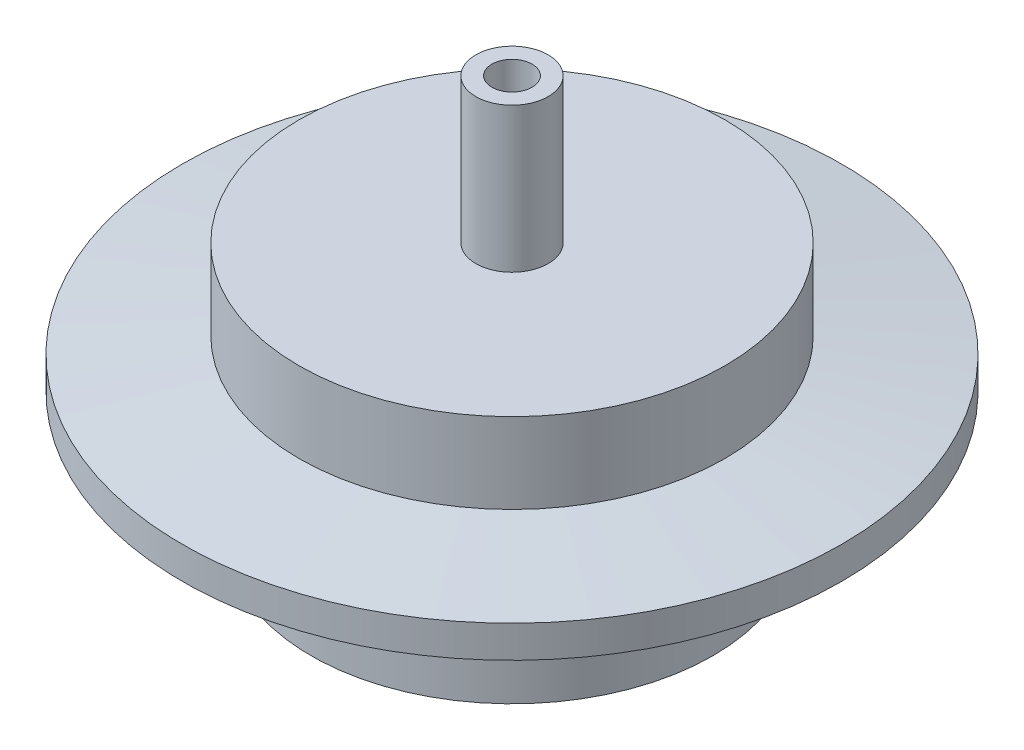
ISO-10303-21;
HEADER;
FILE_DESCRIPTION(('STEP AP214'),'2;1');
FILE_NAME('part.step','',(''),(''),'','','');
FILE_SCHEMA(('AUTOMOTIVE_DESIGN { 1 0 10303 214 1 1 1 1 }'));
ENDSEC;
DATA;
#1=APPLICATION_CONTEXT('core data for automotive mechanical design processes');
#2=APPLICATION_PROTOCOL_DEFINITION('international standard','automotive_design',2000,#1);
#3=PRODUCT_CONTEXT('',#1,'mechanical');
#4=PRODUCT('Part','Part','',(#3));
#5=PRODUCT_RELATED_PRODUCT_CATEGORY('part','',(#4));
#6=PRODUCT_DEFINITION_FORMATION('','',#4);
#7=PRODUCT_DEFINITION_CONTEXT('part definition',#1,'design');
#8=PRODUCT_DEFINITION('design','',#6,#7);
#9=PRODUCT_DEFINITION_SHAPE('','',#8);
#10=(LENGTH_UNIT() NAMED_UNIT(*) SI_UNIT(.MILLI.,.METRE.));
#11=(NAMED_UNIT(*) PLANE_ANGLE_UNIT() SI_UNIT($,.RADIAN.));
#12=(NAMED_UNIT(*) SI_UNIT($,.STERADIAN.) SOLID_ANGLE_UNIT());
#13=UNCERTAINTY_MEASURE_WITH_UNIT(LENGTH_MEASURE(1.E-05),#10,'distance_accuracy_value','');
#14=(GEOMETRIC_REPRESENTATION_CONTEXT(3) GLOBAL_UNCERTAINTY_ASSIGNED_CONTEXT((#13)) GLOBAL_UNIT_ASSIGNED_CONTEXT((#10,
#11,#12)) REPRESENTATION_CONTEXT('',''));
#15=CARTESIAN_POINT('',(0.,0.,0.));
#16=DIRECTION('',(0.,0.,1.));
#17=DIRECTION('',(1.,0.,0.));
#18=AXIS2_PLACEMENT_3D('',#15,#16,#17);
#19=CARTESIAN_POINT('',(1.,0.,0.));
#20=DIRECTION('',(0.,1.,0.));
#21=DIRECTION('',(-1.,0.,0.));
#22=AXIS2_PLACEMENT_3D('',#19,#20,#21);
#23=PLANE('',#22);
#24=CARTESIAN_POINT('',(2.25,0.,0.));
#25=DIRECTION('',(0.,1.,0.));
#26=DIRECTION('',(-1.,0.,0.));
#27=AXIS2_PLACEMENT_3D('',#24,#25,#26);
#28=CIRCLE('',#27,2.25);
#29=CARTESIAN_POINT('',(0.,0.,0.));
#30=VERTEX_POINT('',#29);
#31=EDGE_CURVE('E10',#30,#30,#28,.T.);
#32=ORIENTED_EDGE('',*,*,#31,.T.);
#33=EDGE_LOOP('',(#32));
#34=FACE_BOUND('',#33,.T.);
#35=CARTESIAN_POINT('',(2.25,0.,0.));
#36=DIRECTION('',(0.,1.,0.));
#37=DIRECTION('',(-1.,0.,0.));
#38=AXIS2_PLACEMENT_3D('',#35,#36,#37);
#39=CIRCLE('',#38,1.25);
#40=CARTESIAN_POINT('',(1.,0.,0.));
#41=VERTEX_POINT('',#40);
#42=EDGE_CURVE('E71',#41,#41,#39,.T.);
#43=ORIENTED_EDGE('',*,*,#42,.F.);
#44=EDGE_LOOP('',(#43));
#45=FACE_BOUND('',#44,.T.);
#46=ADVANCED_FACE('F31',(#34,#45),#23,.T.);
#47=CARTESIAN_POINT('',(2.25,0.,0.));
#48=DIRECTION('',(0.,1.,0.));
#49=DIRECTION('',(-1.,0.,0.));
#50=AXIS2_PLACEMENT_3D('',#47,#48,#49);
#51=CYLINDRICAL_SURFACE('',#50,2.25);
#52=CARTESIAN_POINT('',(2.25,-9.,0.));
#53=DIRECTION('',(0.,1.,0.));
#54=DIRECTION('',(-1.,0.,0.));
#55=AXIS2_PLACEMENT_3D('',#52,#53,#54);
#56=CIRCLE('',#55,2.25);
#57=CARTESIAN_POINT('',(0.,-9.,0.));
#58=VERTEX_POINT('',#57);
#59=EDGE_CURVE('E37',#58,#58,#56,.T.);
#60=ORIENTED_EDGE('',*,*,#59,.T.);
#61=EDGE_LOOP('',(#60));
#62=FACE_BOUND('',#61,.T.);
#63=ORIENTED_EDGE('',*,*,#31,.F.);
#64=EDGE_LOOP('',(#63));
#65=FACE_BOUND('',#64,.T.);
#66=ADVANCED_FACE('F79',(#62,#65),#51,.T.);
#67=CARTESIAN_POINT('',(0.,-9.,0.));
#68=DIRECTION('',(0.,1.,0.));
#69=DIRECTION('',(-1.,0.,0.));
#70=AXIS2_PLACEMENT_3D('',#67,#68,#69);
#71=PLANE('',#70);
#72=CARTESIAN_POINT('',(2.25,-9.,0.));
#73=DIRECTION('',(0.,1.,0.));
#74=DIRECTION('',(-1.,0.,0.));
#75=AXIS2_PLACEMENT_3D('',#72,#73,#74);
#76=CIRCLE('',#75,13.25);
#77=CARTESIAN_POINT('',(-11.,-9.,0.));
#78=VERTEX_POINT('',#77);
#79=EDGE_CURVE('E41',#78,#78,#76,.T.);
#80=ORIENTED_EDGE('',*,*,#79,.T.);
#81=EDGE_LOOP('',(#80));
#82=FACE_BOUND('',#81,.T.);
#83=ORIENTED_EDGE('',*,*,#59,.F.);
#84=EDGE_LOOP('',(#83));
#85=FACE_BOUND('',#84,.T.);
#86=ADVANCED_FACE('F83',(#82,#85),#71,.T.);
#87=CARTESIAN_POINT('',(2.25,0.,0.));
#88=DIRECTION('',(0.,1.,0.));
#89=DIRECTION('',(-1.,0.,0.));
#90=AXIS2_PLACEMENT_3D('',#87,#88,#89);
#91=CYLINDRICAL_SURFACE('',#90,13.25);
#92=CARTESIAN_POINT('',(2.25,-14.,0.));
#93=DIRECTION('',(0.,1.,0.));
#94=DIRECTION('',(-1.,0.,0.));
#95=AXIS2_PLACEMENT_3D('',#92,#93,#94);
#96=CIRCLE('',#95,13.25);
#97=CARTESIAN_POINT('',(-11.,-14.,0.));
#98=VERTEX_POINT('',#97);
#99=EDGE_CURVE('E45',#98,#98,#96,.T.);
#100=ORIENTED_EDGE('',*,*,#99,.T.);
#101=EDGE_LOOP('',(#100));
#102=FACE_BOUND('',#101,.T.);
#103=ORIENTED_EDGE('',*,*,#79,.F.);
#104=EDGE_LOOP('',(#103));
#105=FACE_BOUND('',#104,.T.);
#106=ADVANCED_FACE('F87',(#102,#105),#91,.T.);
#107=CARTESIAN_POINT('',(2.25,-14.,0.));
#108=DIRECTION('',(0.,-1.,0.));
#109=DIRECTION('',(1.,0.,0.));
#110=AXIS2_PLACEMENT_3D('',#107,#108,#109);
#111=CONICAL_SURFACE('',#110,13.25,1.43373015248471);
#112=CARTESIAN_POINT('',(2.25,-15.,0.));
#113=DIRECTION('',(0.,1.,0.));
#114=DIRECTION('',(-1.,0.,0.));
#115=AXIS2_PLACEMENT_3D('',#112,#113,#114);
#116=CIRCLE('',#115,20.5);
#117=CARTESIAN_POINT('',(-18.25,-15.,0.));
#118=VERTEX_POINT('',#117);
#119=EDGE_CURVE('E50',#118,#118,#116,.T.);
#120=ORIENTED_EDGE('',*,*,#119,.T.);
#121=EDGE_LOOP('',(#120));
#122=FACE_BOUND('',#121,.T.);
#123=ORIENTED_EDGE('',*,*,#99,.F.);
#124=EDGE_LOOP('',(#123));
#125=FACE_BOUND('',#124,.T.);
#126=ADVANCED_FACE('F94',(#122,#125),#111,.T.);
#127=CARTESIAN_POINT('',(2.25,0.,0.));
#128=DIRECTION('',(0.,1.,0.));
#129=DIRECTION('',(-1.,0.,0.));
#130=AXIS2_PLACEMENT_3D('',#127,#128,#129);
#131=CYLINDRICAL_SURFACE('',#130,20.5);
#132=CARTESIAN_POINT('',(2.25,-17.,0.));
#133=DIRECTION('',(0.,1.,0.));
#134=DIRECTION('',(-1.,0.,0.));
#135=AXIS2_PLACEMENT_3D('',#132,#133,#134);
#136=CIRCLE('',#135,20.5);
#137=CARTESIAN_POINT('',(-18.25,-17.,0.));
#138=VERTEX_POINT('',#137);
#139=EDGE_CURVE('E53',#138,#138,#136,.T.);
#140=ORIENTED_EDGE('',*,*,#139,.T.);
#141=EDGE_LOOP('',(#140));
#142=FACE_BOUND('',#141,.T.);
#143=ORIENTED_EDGE('',*,*,#119,.F.);
#144=EDGE_LOOP('',(#143));
#145=FACE_BOUND('',#144,.T.);
#146=ADVANCED_FACE('F98',(#142,#145),#131,.T.);
#147=CARTESIAN_POINT('',(-18.25,-17.,0.));
#148=DIRECTION('',(0.,-1.,0.));
#149=DIRECTION('',(1.,0.,0.));
#150=AXIS2_PLACEMENT_3D('',#147,#148,#149);
#151=PLANE('',#150);
#152=CARTESIAN_POINT('',(2.25,-17.,0.));
#153=DIRECTION('',(0.,1.,0.));
#154=DIRECTION('',(-1.,0.,0.));
#155=AXIS2_PLACEMENT_3D('',#152,#153,#154);
#156=CIRCLE('',#155,12.5);
#157=CARTESIAN_POINT('',(-10.25,-17.,0.));
#158=VERTEX_POINT('',#157);
#159=EDGE_CURVE('E56',#158,#158,#156,.T.);
#160=ORIENTED_EDGE('',*,*,#159,.T.);
#161=EDGE_LOOP('',(#160));
#162=FACE_BOUND('',#161,.T.);
#163=ORIENTED_EDGE('',*,*,#139,.F.);
#164=EDGE_LOOP('',(#163));
#165=FACE_BOUND('',#164,.T.);
#166=ADVANCED_FACE('F102',(#162,#165),#151,.T.);
#167=CARTESIAN_POINT('',(2.25,0.,0.));
#168=DIRECTION('',(0.,1.,0.));
#169=DIRECTION('',(-1.,0.,0.));
#170=AXIS2_PLACEMENT_3D('',#167,#168,#169);
#171=CYLINDRICAL_SURFACE('',#170,12.5);
#172=CARTESIAN_POINT('',(2.25,-25.,0.));
#173=DIRECTION('',(0.,1.,0.));
#174=DIRECTION('',(-1.,0.,0.));
#175=AXIS2_PLACEMENT_3D('',#172,#173,#174);
#176=CIRCLE('',#175,12.5);
#177=CARTESIAN_POINT('',(-10.25,-25.,0.));
#178=VERTEX_POINT('',#177);
#179=EDGE_CURVE('E59',#178,#178,#176,.T.);
#180=ORIENTED_EDGE('',*,*,#179,.T.);
#181=EDGE_LOOP('',(#180));
#182=FACE_BOUND('',#181,.T.);
#183=ORIENTED_EDGE('',*,*,#159,.F.);
#184=EDGE_LOOP('',(#183));
#185=FACE_BOUND('',#184,.T.);
#186=ADVANCED_FACE('F106',(#182,#185),#171,.T.);
#187=CARTESIAN_POINT('',(-10.25,-25.,0.));
#188=DIRECTION('',(0.,-1.,0.));
#189=DIRECTION('',(1.,0.,0.));
#190=AXIS2_PLACEMENT_3D('',#187,#188,#189);
#191=PLANE('',#190);
#192=CARTESIAN_POINT('',(2.25,-25.,0.));
#193=DIRECTION('',(0.,1.,0.));
#194=DIRECTION('',(-1.,0.,0.));
#195=AXIS2_PLACEMENT_3D('',#192,#193,#194);
#196=CIRCLE('',#195,10.5);
#197=CARTESIAN_POINT('',(-8.24999999999999,-25.,0.));
#198=VERTEX_POINT('',#197);
#199=EDGE_CURVE('E62',#198,#198,#196,.T.);
#200=ORIENTED_EDGE('',*,*,#199,.T.);
#201=EDGE_LOOP('',(#200));
#202=FACE_BOUND('',#201,.T.);
#203=ORIENTED_EDGE('',*,*,#179,.F.);
#204=EDGE_LOOP('',(#203));
#205=FACE_BOUND('',#204,.T.);
#206=ADVANCED_FACE('F110',(#202,#205),#191,.T.);
#207=CARTESIAN_POINT('',(2.25,0.,0.));
#208=DIRECTION('',(0.,1.,0.));
#209=DIRECTION('',(-1.,0.,0.));
#210=AXIS2_PLACEMENT_3D('',#207,#208,#209);
#211=CYLINDRICAL_SURFACE('',#210,10.5);
#212=CARTESIAN_POINT('',(2.25,-14.,0.));
#213=DIRECTION('',(0.,1.,0.));
#214=DIRECTION('',(-1.,0.,0.));
#215=AXIS2_PLACEMENT_3D('',#212,#213,#214);
#216=CIRCLE('',#215,10.5);
#217=CARTESIAN_POINT('',(-8.25,-14.,0.));
#218=VERTEX_POINT('',#217);
#219=EDGE_CURVE('E65',#218,#218,#216,.T.);
#220=ORIENTED_EDGE('',*,*,#219,.T.);
#221=EDGE_LOOP('',(#220));
#222=FACE_BOUND('',#221,.T.);
#223=ORIENTED_EDGE('',*,*,#199,.F.);
#224=EDGE_LOOP('',(#223));
#225=FACE_BOUND('',#224,.T.);
#226=ADVANCED_FACE('F114',(#222,#225),#211,.F.);
#227=CARTESIAN_POINT('',(-8.25,-14.,0.));
#228=DIRECTION('',(0.,-1.,0.));
#229=DIRECTION('',(1.,0.,0.));
#230=AXIS2_PLACEMENT_3D('',#227,#228,#229);
#231=PLANE('',#230);
#232=CARTESIAN_POINT('',(2.25,-14.,0.));
#233=DIRECTION('',(0.,1.,0.));
#234=DIRECTION('',(-1.,0.,0.));
#235=AXIS2_PLACEMENT_3D('',#232,#233,#234);
#236=CIRCLE('',#235,1.25);
#237=CARTESIAN_POINT('',(1.,-14.,0.));
#238=VERTEX_POINT('',#237);
#239=EDGE_CURVE('E68',#238,#238,#236,.T.);
#240=ORIENTED_EDGE('',*,*,#239,.T.);
#241=EDGE_LOOP('',(#240));
#242=FACE_BOUND('',#241,.T.);
#243=ORIENTED_EDGE('',*,*,#219,.F.);
#244=EDGE_LOOP('',(#243));
#245=FACE_BOUND('',#244,.T.);
#246=ADVANCED_FACE('F118',(#242,#245),#231,.T.);
#247=CARTESIAN_POINT('',(2.25,0.,0.));
#248=DIRECTION('',(0.,1.,0.));
#249=DIRECTION('',(-1.,0.,0.));
#250=AXIS2_PLACEMENT_3D('',#247,#248,#249);
#251=CYLINDRICAL_SURFACE('',#250,1.25);
#252=ORIENTED_EDGE('',*,*,#42,.T.);
#253=EDGE_LOOP('',(#252));
#254=FACE_BOUND('',#253,.T.);
#255=ORIENTED_EDGE('',*,*,#239,.F.);
#256=EDGE_LOOP('',(#255));
#257=FACE_BOUND('',#256,.T.);
#258=ADVANCED_FACE('F75',(#254,#257),#251,.F.);
#259=CLOSED_SHELL('',(#46,#66,#86,#106,#126,#146,#166,#186,#206,#226,#246,#258));
#260=MANIFOLD_SOLID_BREP('B2',#259);
#261=ADVANCED_BREP_SHAPE_REPRESENTATION('',(#18,#260),#14);
#262=SHAPE_DEFINITION_REPRESENTATION(#9,#261);
ENDSEC;
END-ISO-10303-21;
